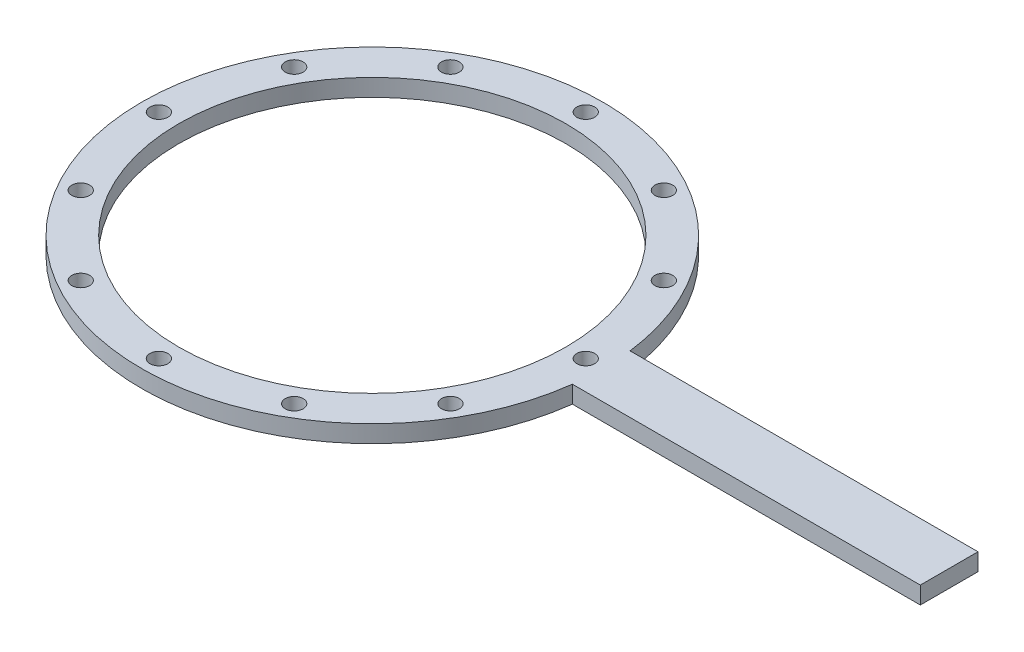
ISO-10303-21;
HEADER;
FILE_DESCRIPTION(('STEP AP214'),'2;1');
FILE_NAME('part.step','',(''),(''),'','','');
FILE_SCHEMA(('AUTOMOTIVE_DESIGN { 1 0 10303 214 1 1 1 1 }'));
ENDSEC;
DATA;
#1=APPLICATION_CONTEXT('core data for automotive mechanical design processes');
#2=APPLICATION_PROTOCOL_DEFINITION('international standard','automotive_design',2000,#1);
#3=PRODUCT_CONTEXT('',#1,'mechanical');
#4=PRODUCT('Part','Part','',(#3));
#5=PRODUCT_RELATED_PRODUCT_CATEGORY('part','',(#4));
#6=PRODUCT_DEFINITION_FORMATION('','',#4);
#7=PRODUCT_DEFINITION_CONTEXT('part definition',#1,'design');
#8=PRODUCT_DEFINITION('design','',#6,#7);
#9=PRODUCT_DEFINITION_SHAPE('','',#8);
#10=(LENGTH_UNIT() NAMED_UNIT(*) SI_UNIT(.MILLI.,.METRE.));
#11=(NAMED_UNIT(*) PLANE_ANGLE_UNIT() SI_UNIT($,.RADIAN.));
#12=(NAMED_UNIT(*) SI_UNIT($,.STERADIAN.) SOLID_ANGLE_UNIT());
#13=UNCERTAINTY_MEASURE_WITH_UNIT(LENGTH_MEASURE(1.E-05),#10,'distance_accuracy_value','');
#14=(GEOMETRIC_REPRESENTATION_CONTEXT(3) GLOBAL_UNCERTAINTY_ASSIGNED_CONTEXT((#13)) GLOBAL_UNIT_ASSIGNED_CONTEXT((#10,
#11,#12)) REPRESENTATION_CONTEXT('',''));
#15=CARTESIAN_POINT('',(0.,0.,0.));
#16=DIRECTION('',(0.,0.,1.));
#17=DIRECTION('',(1.,0.,0.));
#18=AXIS2_PLACEMENT_3D('',#15,#16,#17);
#19=CARTESIAN_POINT('',(0.,3.,5.00000000000001));
#20=DIRECTION('',(0.,0.,1.));
#21=DIRECTION('',(1.,0.,0.));
#22=AXIS2_PLACEMENT_3D('',#19,#20,#21);
#23=PLANE('',#22);
#24=DIRECTION('',(-1.,0.,0.));
#25=VECTOR('',#24,1.);
#26=CARTESIAN_POINT('',(0.,0.,5.00000000000001));
#27=LINE('',#26,#25);
#28=CARTESIAN_POINT('',(100.,0.,5.));
#29=VERTEX_POINT('',#28);
#30=CARTESIAN_POINT('',(39.6862696659689,0.,5.00000000000001));
#31=VERTEX_POINT('',#30);
#32=EDGE_CURVE('E156',#29,#31,#27,.T.);
#33=ORIENTED_EDGE('',*,*,#32,.F.);
#34=DIRECTION('',(0.,-1.,0.));
#35=VECTOR('',#34,1.);
#36=CARTESIAN_POINT('',(100.,3.,5.));
#37=LINE('',#36,#35);
#38=CARTESIAN_POINT('',(100.,3.,5.));
#39=VERTEX_POINT('',#38);
#40=EDGE_CURVE('E117',#39,#29,#37,.T.);
#41=ORIENTED_EDGE('',*,*,#40,.F.);
#42=DIRECTION('',(-1.,0.,0.));
#43=VECTOR('',#42,1.);
#44=CARTESIAN_POINT('',(0.,3.,5.00000000000001));
#45=LINE('',#44,#43);
#46=CARTESIAN_POINT('',(39.6862696659689,3.,5.00000000000001));
#47=VERTEX_POINT('',#46);
#48=EDGE_CURVE('E153',#39,#47,#45,.T.);
#49=ORIENTED_EDGE('',*,*,#48,.T.);
#50=DIRECTION('',(0.,-1.,0.));
#51=VECTOR('',#50,1.);
#52=CARTESIAN_POINT('',(39.6862696659689,3.,5.00000000000001));
#53=LINE('',#52,#51);
#54=EDGE_CURVE('E12',#47,#31,#53,.T.);
#55=ORIENTED_EDGE('',*,*,#54,.T.);
#56=EDGE_LOOP('',(#33,#41,#49,#55));
#57=FACE_BOUND('',#56,.T.);
#58=ADVANCED_FACE('F110',(#57),#23,.T.);
#59=CARTESIAN_POINT('',(0.,0.,0.));
#60=DIRECTION('',(0.,1.,0.));
#61=DIRECTION('',(0.,0.,1.));
#62=AXIS2_PLACEMENT_3D('',#59,#60,#61);
#63=PLANE('',#62);
#64=CARTESIAN_POINT('',(18.4999999999999,0.,-32.0429399400243));
#65=DIRECTION('',(0.,1.,0.));
#66=DIRECTION('',(0.86602540378444,0.,0.499999999999998));
#67=AXIS2_PLACEMENT_3D('',#64,#65,#66);
#68=CIRCLE('',#67,1.55);
#69=CARTESIAN_POINT('',(19.8423393758658,0.,-31.2679399400243));
#70=VERTEX_POINT('',#69);
#71=EDGE_CURVE('E217',#70,#70,#68,.T.);
#72=ORIENTED_EDGE('',*,*,#71,.T.);
#73=EDGE_LOOP('',(#72));
#74=FACE_BOUND('',#73,.T.);
#75=CARTESIAN_POINT('',(-1.29184809537196E-13,0.,-37.));
#76=DIRECTION('',(0.,1.,0.));
#77=DIRECTION('',(1.,0.,0.));
#78=AXIS2_PLACEMENT_3D('',#75,#76,#77);
#79=CIRCLE('',#78,1.55);
#80=CARTESIAN_POINT('',(1.54999999999987,0.,-37.));
#81=VERTEX_POINT('',#80);
#82=EDGE_CURVE('E273',#81,#81,#79,.T.);
#83=ORIENTED_EDGE('',*,*,#82,.T.);
#84=EDGE_LOOP('',(#83));
#85=FACE_BOUND('',#84,.T.);
#86=CARTESIAN_POINT('',(-18.5000000000002,0.,-32.0429399400241));
#87=DIRECTION('',(0.,1.,0.));
#88=DIRECTION('',(0.866025403784436,0.,-0.500000000000004));
#89=AXIS2_PLACEMENT_3D('',#86,#87,#88);
#90=CIRCLE('',#89,1.55);
#91=CARTESIAN_POINT('',(-17.1576606241343,0.,-32.8179399400242));
#92=VERTEX_POINT('',#91);
#93=EDGE_CURVE('E270',#92,#92,#90,.T.);
#94=ORIENTED_EDGE('',*,*,#93,.T.);
#95=EDGE_LOOP('',(#94));
#96=FACE_BOUND('',#95,.T.);
#97=CARTESIAN_POINT('',(-32.0429399400243,0.,-18.4999999999998));
#98=DIRECTION('',(0.,1.,0.));
#99=DIRECTION('',(0.499999999999995,0.,-0.866025403784442));
#100=AXIS2_PLACEMENT_3D('',#97,#98,#99);
#101=CIRCLE('',#100,1.55);
#102=CARTESIAN_POINT('',(-31.2679399400243,0.,-19.8423393758657));
#103=VERTEX_POINT('',#102);
#104=EDGE_CURVE('E256',#103,#103,#101,.T.);
#105=ORIENTED_EDGE('',*,*,#104,.T.);
#106=EDGE_LOOP('',(#105));
#107=FACE_BOUND('',#106,.T.);
#108=CARTESIAN_POINT('',(-37.,0.,0.));
#109=DIRECTION('',(0.,1.,0.));
#110=DIRECTION('',(0.,0.,-1.));
#111=AXIS2_PLACEMENT_3D('',#108,#109,#110);
#112=CIRCLE('',#111,1.55);
#113=CARTESIAN_POINT('',(-37.,0.,-1.55));
#114=VERTEX_POINT('',#113);
#115=EDGE_CURVE('E252',#114,#114,#112,.T.);
#116=ORIENTED_EDGE('',*,*,#115,.T.);
#117=EDGE_LOOP('',(#116));
#118=FACE_BOUND('',#117,.T.);
#119=CARTESIAN_POINT('',(-32.0429399400241,0.,18.5000000000003));
#120=DIRECTION('',(0.,1.,0.));
#121=DIRECTION('',(-0.500000000000007,0.,-0.866025403784435));
#122=AXIS2_PLACEMENT_3D('',#119,#120,#121);
#123=CIRCLE('',#122,1.55);
#124=CARTESIAN_POINT('',(-32.8179399400241,0.,17.1576606241344));
#125=VERTEX_POINT('',#124);
#126=EDGE_CURVE('E243',#125,#125,#123,.T.);
#127=ORIENTED_EDGE('',*,*,#126,.T.);
#128=EDGE_LOOP('',(#127));
#129=FACE_BOUND('',#128,.T.);
#130=CARTESIAN_POINT('',(-18.4999999999997,0.,32.0429399400244));
#131=DIRECTION('',(0.,1.,0.));
#132=DIRECTION('',(-0.866025403784443,0.,-0.499999999999992));
#133=AXIS2_PLACEMENT_3D('',#130,#131,#132);
#134=CIRCLE('',#133,1.55);
#135=CARTESIAN_POINT('',(-19.8423393758656,0.,31.2679399400244));
#136=VERTEX_POINT('',#135);
#137=EDGE_CURVE('E232',#136,#136,#134,.T.);
#138=ORIENTED_EDGE('',*,*,#137,.T.);
#139=EDGE_LOOP('',(#138));
#140=FACE_BOUND('',#139,.T.);
#141=CARTESIAN_POINT('',(3.87554428611588E-13,0.,37.));
#142=DIRECTION('',(0.,1.,0.));
#143=DIRECTION('',(-1.,0.,0.));
#144=AXIS2_PLACEMENT_3D('',#141,#142,#143);
#145=CIRCLE('',#144,1.55);
#146=CARTESIAN_POINT('',(-1.54999999999961,0.,37.));
#147=VERTEX_POINT('',#146);
#148=EDGE_CURVE('E228',#147,#147,#145,.T.);
#149=ORIENTED_EDGE('',*,*,#148,.T.);
#150=EDGE_LOOP('',(#149));
#151=FACE_BOUND('',#150,.T.);
#152=CARTESIAN_POINT('',(18.5000000000004,0.,32.042939940024));
#153=DIRECTION('',(0.,1.,0.));
#154=DIRECTION('',(-0.866025403784433,0.,0.50000000000001));
#155=AXIS2_PLACEMENT_3D('',#152,#153,#154);
#156=CIRCLE('',#155,1.55);
#157=CARTESIAN_POINT('',(17.1576606241345,0.,32.817939940024));
#158=VERTEX_POINT('',#157);
#159=EDGE_CURVE('E227',#158,#158,#156,.T.);
#160=ORIENTED_EDGE('',*,*,#159,.T.);
#161=EDGE_LOOP('',(#160));
#162=FACE_BOUND('',#161,.T.);
#163=CARTESIAN_POINT('',(32.0429399400245,0.,18.4999999999996));
#164=DIRECTION('',(0.,1.,0.));
#165=DIRECTION('',(-0.499999999999989,0.,0.866025403784445));
#166=AXIS2_PLACEMENT_3D('',#163,#164,#165);
#167=CIRCLE('',#166,1.55);
#168=CARTESIAN_POINT('',(31.2679399400245,0.,19.8423393758655));
#169=VERTEX_POINT('',#168);
#170=EDGE_CURVE('E289',#169,#169,#167,.T.);
#171=ORIENTED_EDGE('',*,*,#170,.T.);
#172=EDGE_LOOP('',(#171));
#173=FACE_BOUND('',#172,.T.);
#174=CARTESIAN_POINT('',(32.0429399400242,0.,-18.5));
#175=DIRECTION('',(0.,1.,0.));
#176=DIRECTION('',(0.500000000000001,0.,0.866025403784438));
#177=AXIS2_PLACEMENT_3D('',#174,#175,#176);
#178=CIRCLE('',#177,1.55);
#179=CARTESIAN_POINT('',(32.8179399400242,0.,-17.1576606241342));
#180=VERTEX_POINT('',#179);
#181=EDGE_CURVE('E215',#180,#180,#178,.T.);
#182=ORIENTED_EDGE('',*,*,#181,.T.);
#183=EDGE_LOOP('',(#182));
#184=FACE_BOUND('',#183,.T.);
#185=CARTESIAN_POINT('',(37.,0.,0.));
#186=DIRECTION('',(0.,1.,0.));
#187=DIRECTION('',(0.,0.,1.));
#188=AXIS2_PLACEMENT_3D('',#185,#186,#187);
#189=CIRCLE('',#188,1.55);
#190=CARTESIAN_POINT('',(37.,0.,1.55));
#191=VERTEX_POINT('',#190);
#192=EDGE_CURVE('E199',#191,#191,#189,.T.);
#193=ORIENTED_EDGE('',*,*,#192,.T.);
#194=EDGE_LOOP('',(#193));
#195=FACE_BOUND('',#194,.T.);
#196=ORIENTED_EDGE('',*,*,#32,.T.);
#197=CARTESIAN_POINT('',(0.,0.,0.));
#198=DIRECTION('',(0.,1.,0.));
#199=DIRECTION('',(0.,0.,1.));
#200=AXIS2_PLACEMENT_3D('',#197,#198,#199);
#201=CIRCLE('',#200,40.);
#202=CARTESIAN_POINT('',(39.6862696659689,0.,-5.00000000000001));
#203=VERTEX_POINT('',#202);
#204=EDGE_CURVE('E111',#203,#31,#201,.T.);
#205=ORIENTED_EDGE('',*,*,#204,.F.);
#206=DIRECTION('',(-1.,0.,0.));
#207=VECTOR('',#206,1.);
#208=CARTESIAN_POINT('',(0.,0.,-5.00000000000001));
#209=LINE('',#208,#207);
#210=CARTESIAN_POINT('',(100.,0.,-5.));
#211=VERTEX_POINT('',#210);
#212=EDGE_CURVE('E171',#211,#203,#209,.T.);
#213=ORIENTED_EDGE('',*,*,#212,.F.);
#214=DIRECTION('',(0.,0.,1.));
#215=VECTOR('',#214,1.);
#216=CARTESIAN_POINT('',(100.,0.,0.));
#217=LINE('',#216,#215);
#218=EDGE_CURVE('E182',#211,#29,#217,.T.);
#219=ORIENTED_EDGE('',*,*,#218,.T.);
#220=EDGE_LOOP('',(#196,#205,#213,#219));
#221=FACE_BOUND('',#220,.T.);
#222=CARTESIAN_POINT('',(0.,0.,0.));
#223=DIRECTION('',(0.,1.,0.));
#224=DIRECTION('',(0.,0.,1.));
#225=AXIS2_PLACEMENT_3D('',#222,#223,#224);
#226=CIRCLE('',#225,33.55);
#227=CARTESIAN_POINT('',(0.,0.,33.55));
#228=VERTEX_POINT('',#227);
#229=EDGE_CURVE('E200',#228,#228,#226,.T.);
#230=ORIENTED_EDGE('',*,*,#229,.T.);
#231=EDGE_LOOP('',(#230));
#232=FACE_BOUND('',#231,.T.);
#233=ADVANCED_FACE('F305',(#74,#85,#96,#107,#118,#129,#140,#151,#162,#173,#184,#195,#221,#232),
#63,.F.);
#234=CARTESIAN_POINT('',(100.,3.,0.));
#235=DIRECTION('',(1.,0.,0.));
#236=DIRECTION('',(0.,0.,-1.));
#237=AXIS2_PLACEMENT_3D('',#234,#235,#236);
#238=PLANE('',#237);
#239=ORIENTED_EDGE('',*,*,#218,.F.);
#240=DIRECTION('',(0.,-1.,0.));
#241=VECTOR('',#240,1.);
#242=CARTESIAN_POINT('',(100.,3.,-5.));
#243=LINE('',#242,#241);
#244=CARTESIAN_POINT('',(100.,3.,-5.));
#245=VERTEX_POINT('',#244);
#246=EDGE_CURVE('E139',#245,#211,#243,.T.);
#247=ORIENTED_EDGE('',*,*,#246,.F.);
#248=DIRECTION('',(0.,0.,1.));
#249=VECTOR('',#248,1.);
#250=CARTESIAN_POINT('',(100.,3.,0.));
#251=LINE('',#250,#249);
#252=EDGE_CURVE('E166',#245,#39,#251,.T.);
#253=ORIENTED_EDGE('',*,*,#252,.T.);
#254=ORIENTED_EDGE('',*,*,#40,.T.);
#255=EDGE_LOOP('',(#239,#247,#253,#254));
#256=FACE_BOUND('',#255,.T.);
#257=ADVANCED_FACE('F173',(#256),#238,.T.);
#258=CARTESIAN_POINT('',(0.,3.,-5.00000000000001));
#259=DIRECTION('',(0.,0.,1.));
#260=DIRECTION('',(1.,0.,0.));
#261=AXIS2_PLACEMENT_3D('',#258,#259,#260);
#262=PLANE('',#261);
#263=ORIENTED_EDGE('',*,*,#212,.T.);
#264=DIRECTION('',(0.,-1.,0.));
#265=VECTOR('',#264,1.);
#266=CARTESIAN_POINT('',(39.6862696659689,3.,-5.00000000000001));
#267=LINE('',#266,#265);
#268=CARTESIAN_POINT('',(39.6862696659689,3.,-5.00000000000001));
#269=VERTEX_POINT('',#268);
#270=EDGE_CURVE('E130',#269,#203,#267,.T.);
#271=ORIENTED_EDGE('',*,*,#270,.F.);
#272=DIRECTION('',(-1.,0.,0.));
#273=VECTOR('',#272,1.);
#274=CARTESIAN_POINT('',(0.,3.,-5.00000000000001));
#275=LINE('',#274,#273);
#276=EDGE_CURVE('E174',#245,#269,#275,.T.);
#277=ORIENTED_EDGE('',*,*,#276,.F.);
#278=ORIENTED_EDGE('',*,*,#246,.T.);
#279=EDGE_LOOP('',(#263,#271,#277,#278));
#280=FACE_BOUND('',#279,.T.);
#281=ADVANCED_FACE('F314',(#280),#262,.F.);
#282=CARTESIAN_POINT('',(0.,3.,0.));
#283=DIRECTION('',(0.,1.,0.));
#284=DIRECTION('',(0.,0.,1.));
#285=AXIS2_PLACEMENT_3D('',#282,#283,#284);
#286=PLANE('',#285);
#287=CARTESIAN_POINT('',(18.4999999999999,3.,-32.0429399400243));
#288=DIRECTION('',(0.,1.,0.));
#289=DIRECTION('',(0.86602540378444,0.,0.499999999999998));
#290=AXIS2_PLACEMENT_3D('',#287,#288,#289);
#291=CIRCLE('',#290,1.55);
#292=CARTESIAN_POINT('',(19.8423393758658,3.,-31.2679399400243));
#293=VERTEX_POINT('',#292);
#294=EDGE_CURVE('E276',#293,#293,#291,.T.);
#295=ORIENTED_EDGE('',*,*,#294,.F.);
#296=EDGE_LOOP('',(#295));
#297=FACE_BOUND('',#296,.T.);
#298=CARTESIAN_POINT('',(-1.29184809537196E-13,3.,-37.));
#299=DIRECTION('',(0.,1.,0.));
#300=DIRECTION('',(1.,0.,0.));
#301=AXIS2_PLACEMENT_3D('',#298,#299,#300);
#302=CIRCLE('',#301,1.55);
#303=CARTESIAN_POINT('',(1.54999999999987,3.,-37.));
#304=VERTEX_POINT('',#303);
#305=EDGE_CURVE('E272',#304,#304,#302,.T.);
#306=ORIENTED_EDGE('',*,*,#305,.F.);
#307=EDGE_LOOP('',(#306));
#308=FACE_BOUND('',#307,.T.);
#309=CARTESIAN_POINT('',(-18.5000000000002,3.,-32.0429399400241));
#310=DIRECTION('',(0.,1.,0.));
#311=DIRECTION('',(0.866025403784436,0.,-0.500000000000004));
#312=AXIS2_PLACEMENT_3D('',#309,#310,#311);
#313=CIRCLE('',#312,1.55);
#314=CARTESIAN_POINT('',(-17.1576606241343,3.,-32.8179399400242));
#315=VERTEX_POINT('',#314);
#316=EDGE_CURVE('E262',#315,#315,#313,.T.);
#317=ORIENTED_EDGE('',*,*,#316,.F.);
#318=EDGE_LOOP('',(#317));
#319=FACE_BOUND('',#318,.T.);
#320=CARTESIAN_POINT('',(-32.0429399400243,3.,-18.4999999999998));
#321=DIRECTION('',(0.,1.,0.));
#322=DIRECTION('',(0.499999999999995,0.,-0.866025403784442));
#323=AXIS2_PLACEMENT_3D('',#320,#321,#322);
#324=CIRCLE('',#323,1.55);
#325=CARTESIAN_POINT('',(-31.2679399400243,3.,-19.8423393758657));
#326=VERTEX_POINT('',#325);
#327=EDGE_CURVE('E253',#326,#326,#324,.T.);
#328=ORIENTED_EDGE('',*,*,#327,.F.);
#329=EDGE_LOOP('',(#328));
#330=FACE_BOUND('',#329,.T.);
#331=CARTESIAN_POINT('',(-37.,3.,0.));
#332=DIRECTION('',(0.,1.,0.));
#333=DIRECTION('',(0.,0.,-1.));
#334=AXIS2_PLACEMENT_3D('',#331,#332,#333);
#335=CIRCLE('',#334,1.55);
#336=CARTESIAN_POINT('',(-37.,3.,-1.55));
#337=VERTEX_POINT('',#336);
#338=EDGE_CURVE('E250',#337,#337,#335,.T.);
#339=ORIENTED_EDGE('',*,*,#338,.F.);
#340=EDGE_LOOP('',(#339));
#341=FACE_BOUND('',#340,.T.);
#342=CARTESIAN_POINT('',(-32.0429399400241,3.,18.5000000000003));
#343=DIRECTION('',(0.,1.,0.));
#344=DIRECTION('',(-0.500000000000007,0.,-0.866025403784435));
#345=AXIS2_PLACEMENT_3D('',#342,#343,#344);
#346=CIRCLE('',#345,1.55);
#347=CARTESIAN_POINT('',(-32.8179399400241,3.,17.1576606241344));
#348=VERTEX_POINT('',#347);
#349=EDGE_CURVE('E237',#348,#348,#346,.T.);
#350=ORIENTED_EDGE('',*,*,#349,.F.);
#351=EDGE_LOOP('',(#350));
#352=FACE_BOUND('',#351,.T.);
#353=CARTESIAN_POINT('',(-18.4999999999997,3.,32.0429399400244));
#354=DIRECTION('',(0.,1.,0.));
#355=DIRECTION('',(-0.866025403784443,0.,-0.499999999999992));
#356=AXIS2_PLACEMENT_3D('',#353,#354,#355);
#357=CIRCLE('',#356,1.55);
#358=CARTESIAN_POINT('',(-19.8423393758656,3.,31.2679399400244));
#359=VERTEX_POINT('',#358);
#360=EDGE_CURVE('E233',#359,#359,#357,.T.);
#361=ORIENTED_EDGE('',*,*,#360,.F.);
#362=EDGE_LOOP('',(#361));
#363=FACE_BOUND('',#362,.T.);
#364=CARTESIAN_POINT('',(3.87554428611588E-13,3.,37.));
#365=DIRECTION('',(0.,1.,0.));
#366=DIRECTION('',(-1.,0.,0.));
#367=AXIS2_PLACEMENT_3D('',#364,#365,#366);
#368=CIRCLE('',#367,1.55);
#369=CARTESIAN_POINT('',(-1.54999999999961,3.,37.));
#370=VERTEX_POINT('',#369);
#371=EDGE_CURVE('E225',#370,#370,#368,.T.);
#372=ORIENTED_EDGE('',*,*,#371,.F.);
#373=EDGE_LOOP('',(#372));
#374=FACE_BOUND('',#373,.T.);
#375=CARTESIAN_POINT('',(18.5000000000004,3.,32.042939940024));
#376=DIRECTION('',(0.,1.,0.));
#377=DIRECTION('',(-0.866025403784433,0.,0.50000000000001));
#378=AXIS2_PLACEMENT_3D('',#375,#376,#377);
#379=CIRCLE('',#378,1.55);
#380=CARTESIAN_POINT('',(17.1576606241345,3.,32.817939940024));
#381=VERTEX_POINT('',#380);
#382=EDGE_CURVE('E295',#381,#381,#379,.T.);
#383=ORIENTED_EDGE('',*,*,#382,.F.);
#384=EDGE_LOOP('',(#383));
#385=FACE_BOUND('',#384,.T.);
#386=CARTESIAN_POINT('',(32.0429399400245,3.,18.4999999999996));
#387=DIRECTION('',(0.,1.,0.));
#388=DIRECTION('',(-0.499999999999989,0.,0.866025403784445));
#389=AXIS2_PLACEMENT_3D('',#386,#387,#388);
#390=CIRCLE('',#389,1.55);
#391=CARTESIAN_POINT('',(31.2679399400245,3.,19.8423393758655));
#392=VERTEX_POINT('',#391);
#393=EDGE_CURVE('E286',#392,#392,#390,.T.);
#394=ORIENTED_EDGE('',*,*,#393,.F.);
#395=EDGE_LOOP('',(#394));
#396=FACE_BOUND('',#395,.T.);
#397=CARTESIAN_POINT('',(32.0429399400242,3.,-18.5));
#398=DIRECTION('',(0.,1.,0.));
#399=DIRECTION('',(0.500000000000001,0.,0.866025403784438));
#400=AXIS2_PLACEMENT_3D('',#397,#398,#399);
#401=CIRCLE('',#400,1.55);
#402=CARTESIAN_POINT('',(32.8179399400242,3.,-17.1576606241342));
#403=VERTEX_POINT('',#402);
#404=EDGE_CURVE('E211',#403,#403,#401,.T.);
#405=ORIENTED_EDGE('',*,*,#404,.F.);
#406=EDGE_LOOP('',(#405));
#407=FACE_BOUND('',#406,.T.);
#408=CARTESIAN_POINT('',(37.,3.,0.));
#409=DIRECTION('',(0.,1.,0.));
#410=DIRECTION('',(0.,0.,1.));
#411=AXIS2_PLACEMENT_3D('',#408,#409,#410);
#412=CIRCLE('',#411,1.55);
#413=CARTESIAN_POINT('',(37.,3.,1.55));
#414=VERTEX_POINT('',#413);
#415=EDGE_CURVE('E207',#414,#414,#412,.T.);
#416=ORIENTED_EDGE('',*,*,#415,.F.);
#417=EDGE_LOOP('',(#416));
#418=FACE_BOUND('',#417,.T.);
#419=ORIENTED_EDGE('',*,*,#276,.T.);
#420=CARTESIAN_POINT('',(0.,3.,0.));
#421=DIRECTION('',(0.,1.,0.));
#422=DIRECTION('',(0.,0.,1.));
#423=AXIS2_PLACEMENT_3D('',#420,#421,#422);
#424=CIRCLE('',#423,40.);
#425=EDGE_CURVE('E169',#269,#47,#424,.T.);
#426=ORIENTED_EDGE('',*,*,#425,.T.);
#427=ORIENTED_EDGE('',*,*,#48,.F.);
#428=ORIENTED_EDGE('',*,*,#252,.F.);
#429=EDGE_LOOP('',(#419,#426,#427,#428));
#430=FACE_BOUND('',#429,.T.);
#431=CARTESIAN_POINT('',(0.,3.,0.));
#432=DIRECTION('',(0.,1.,0.));
#433=DIRECTION('',(0.,0.,1.));
#434=AXIS2_PLACEMENT_3D('',#431,#432,#433);
#435=CIRCLE('',#434,33.55);
#436=CARTESIAN_POINT('',(0.,3.,33.55));
#437=VERTEX_POINT('',#436);
#438=EDGE_CURVE('E195',#437,#437,#435,.T.);
#439=ORIENTED_EDGE('',*,*,#438,.F.);
#440=EDGE_LOOP('',(#439));
#441=FACE_BOUND('',#440,.T.);
#442=ADVANCED_FACE('F168',(#297,#308,#319,#330,#341,#352,#363,#374,#385,#396,#407,#418,#430,
#441),#286,.T.);
#443=CARTESIAN_POINT('',(0.,3.,0.));
#444=DIRECTION('',(0.,-1.,0.));
#445=DIRECTION('',(0.,0.,-1.));
#446=AXIS2_PLACEMENT_3D('',#443,#444,#445);
#447=CYLINDRICAL_SURFACE('',#446,33.55);
#448=ORIENTED_EDGE('',*,*,#438,.T.);
#449=EDGE_LOOP('',(#448));
#450=FACE_BOUND('',#449,.T.);
#451=ORIENTED_EDGE('',*,*,#229,.F.);
#452=EDGE_LOOP('',(#451));
#453=FACE_BOUND('',#452,.T.);
#454=ADVANCED_FACE('F107',(#450,#453),#447,.F.);
#455=CARTESIAN_POINT('',(0.,3.,0.));
#456=DIRECTION('',(0.,-1.,0.));
#457=DIRECTION('',(0.,0.,-1.));
#458=AXIS2_PLACEMENT_3D('',#455,#456,#457);
#459=CYLINDRICAL_SURFACE('',#458,40.);
#460=ORIENTED_EDGE('',*,*,#204,.T.);
#461=ORIENTED_EDGE('',*,*,#54,.F.);
#462=ORIENTED_EDGE('',*,*,#425,.F.);
#463=ORIENTED_EDGE('',*,*,#270,.T.);
#464=EDGE_LOOP('',(#460,#461,#462,#463));
#465=FACE_BOUND('',#464,.T.);
#466=ADVANCED_FACE('F316',(#465),#459,.T.);
#467=CARTESIAN_POINT('',(37.,0.,0.));
#468=DIRECTION('',(0.,1.,0.));
#469=DIRECTION('',(0.,0.,1.));
#470=AXIS2_PLACEMENT_3D('',#467,#468,#469);
#471=CYLINDRICAL_SURFACE('',#470,1.55);
#472=ORIENTED_EDGE('',*,*,#192,.F.);
#473=EDGE_LOOP('',(#472));
#474=FACE_BOUND('',#473,.T.);
#475=ORIENTED_EDGE('',*,*,#415,.T.);
#476=EDGE_LOOP('',(#475));
#477=FACE_BOUND('',#476,.T.);
#478=ADVANCED_FACE('F319',(#474,#477),#471,.F.);
#479=CARTESIAN_POINT('',(32.0429399400242,0.,-18.5));
#480=DIRECTION('',(0.,1.,0.));
#481=DIRECTION('',(0.,0.,1.));
#482=AXIS2_PLACEMENT_3D('',#479,#480,#481);
#483=CYLINDRICAL_SURFACE('',#482,1.55);
#484=ORIENTED_EDGE('',*,*,#181,.F.);
#485=EDGE_LOOP('',(#484));
#486=FACE_BOUND('',#485,.T.);
#487=ORIENTED_EDGE('',*,*,#404,.T.);
#488=EDGE_LOOP('',(#487));
#489=FACE_BOUND('',#488,.T.);
#490=ADVANCED_FACE('F330',(#486,#489),#483,.F.);
#491=CARTESIAN_POINT('',(32.0429399400245,0.,18.4999999999996));
#492=DIRECTION('',(0.,1.,0.));
#493=DIRECTION('',(0.,0.,1.));
#494=AXIS2_PLACEMENT_3D('',#491,#492,#493);
#495=CYLINDRICAL_SURFACE('',#494,1.55);
#496=ORIENTED_EDGE('',*,*,#170,.F.);
#497=EDGE_LOOP('',(#496));
#498=FACE_BOUND('',#497,.T.);
#499=ORIENTED_EDGE('',*,*,#393,.T.);
#500=EDGE_LOOP('',(#499));
#501=FACE_BOUND('',#500,.T.);
#502=ADVANCED_FACE('F307',(#498,#501),#495,.F.);
#503=CARTESIAN_POINT('',(18.5000000000004,0.,32.042939940024));
#504=DIRECTION('',(0.,1.,0.));
#505=DIRECTION('',(0.,0.,1.));
#506=AXIS2_PLACEMENT_3D('',#503,#504,#505);
#507=CYLINDRICAL_SURFACE('',#506,1.55);
#508=ORIENTED_EDGE('',*,*,#159,.F.);
#509=EDGE_LOOP('',(#508));
#510=FACE_BOUND('',#509,.T.);
#511=ORIENTED_EDGE('',*,*,#382,.T.);
#512=EDGE_LOOP('',(#511));
#513=FACE_BOUND('',#512,.T.);
#514=ADVANCED_FACE('F304',(#510,#513),#507,.F.);
#515=CARTESIAN_POINT('',(3.87554428611588E-13,0.,37.));
#516=DIRECTION('',(0.,1.,0.));
#517=DIRECTION('',(0.,0.,1.));
#518=AXIS2_PLACEMENT_3D('',#515,#516,#517);
#519=CYLINDRICAL_SURFACE('',#518,1.55);
#520=ORIENTED_EDGE('',*,*,#148,.F.);
#521=EDGE_LOOP('',(#520));
#522=FACE_BOUND('',#521,.T.);
#523=ORIENTED_EDGE('',*,*,#371,.T.);
#524=EDGE_LOOP('',(#523));
#525=FACE_BOUND('',#524,.T.);
#526=ADVANCED_FACE('F308',(#522,#525),#519,.F.);
#527=CARTESIAN_POINT('',(-18.4999999999997,0.,32.0429399400244));
#528=DIRECTION('',(0.,1.,0.));
#529=DIRECTION('',(0.,0.,1.));
#530=AXIS2_PLACEMENT_3D('',#527,#528,#529);
#531=CYLINDRICAL_SURFACE('',#530,1.55);
#532=ORIENTED_EDGE('',*,*,#137,.F.);
#533=EDGE_LOOP('',(#532));
#534=FACE_BOUND('',#533,.T.);
#535=ORIENTED_EDGE('',*,*,#360,.T.);
#536=EDGE_LOOP('',(#535));
#537=FACE_BOUND('',#536,.T.);
#538=ADVANCED_FACE('F400',(#534,#537),#531,.F.);
#539=CARTESIAN_POINT('',(-32.0429399400241,0.,18.5000000000003));
#540=DIRECTION('',(0.,1.,0.));
#541=DIRECTION('',(0.,0.,1.));
#542=AXIS2_PLACEMENT_3D('',#539,#540,#541);
#543=CYLINDRICAL_SURFACE('',#542,1.55);
#544=ORIENTED_EDGE('',*,*,#126,.F.);
#545=EDGE_LOOP('',(#544));
#546=FACE_BOUND('',#545,.T.);
#547=ORIENTED_EDGE('',*,*,#349,.T.);
#548=EDGE_LOOP('',(#547));
#549=FACE_BOUND('',#548,.T.);
#550=ADVANCED_FACE('F410',(#546,#549),#543,.F.);
#551=CARTESIAN_POINT('',(-37.,0.,0.));
#552=DIRECTION('',(0.,1.,0.));
#553=DIRECTION('',(0.,0.,1.));
#554=AXIS2_PLACEMENT_3D('',#551,#552,#553);
#555=CYLINDRICAL_SURFACE('',#554,1.55);
#556=ORIENTED_EDGE('',*,*,#115,.F.);
#557=EDGE_LOOP('',(#556));
#558=FACE_BOUND('',#557,.T.);
#559=ORIENTED_EDGE('',*,*,#338,.T.);
#560=EDGE_LOOP('',(#559));
#561=FACE_BOUND('',#560,.T.);
#562=ADVANCED_FACE('F420',(#558,#561),#555,.F.);
#563=CARTESIAN_POINT('',(-32.0429399400243,0.,-18.4999999999998));
#564=DIRECTION('',(0.,1.,0.));
#565=DIRECTION('',(0.,0.,1.));
#566=AXIS2_PLACEMENT_3D('',#563,#564,#565);
#567=CYLINDRICAL_SURFACE('',#566,1.55);
#568=ORIENTED_EDGE('',*,*,#104,.F.);
#569=EDGE_LOOP('',(#568));
#570=FACE_BOUND('',#569,.T.);
#571=ORIENTED_EDGE('',*,*,#327,.T.);
#572=EDGE_LOOP('',(#571));
#573=FACE_BOUND('',#572,.T.);
#574=ADVANCED_FACE('F430',(#570,#573),#567,.F.);
#575=CARTESIAN_POINT('',(-18.5000000000002,0.,-32.0429399400241));
#576=DIRECTION('',(0.,1.,0.));
#577=DIRECTION('',(0.,0.,1.));
#578=AXIS2_PLACEMENT_3D('',#575,#576,#577);
#579=CYLINDRICAL_SURFACE('',#578,1.55);
#580=ORIENTED_EDGE('',*,*,#93,.F.);
#581=EDGE_LOOP('',(#580));
#582=FACE_BOUND('',#581,.T.);
#583=ORIENTED_EDGE('',*,*,#316,.T.);
#584=EDGE_LOOP('',(#583));
#585=FACE_BOUND('',#584,.T.);
#586=ADVANCED_FACE('F440',(#582,#585),#579,.F.);
#587=CARTESIAN_POINT('',(-1.29184809537196E-13,0.,-37.));
#588=DIRECTION('',(0.,1.,0.));
#589=DIRECTION('',(0.,0.,1.));
#590=AXIS2_PLACEMENT_3D('',#587,#588,#589);
#591=CYLINDRICAL_SURFACE('',#590,1.55);
#592=ORIENTED_EDGE('',*,*,#82,.F.);
#593=EDGE_LOOP('',(#592));
#594=FACE_BOUND('',#593,.T.);
#595=ORIENTED_EDGE('',*,*,#305,.T.);
#596=EDGE_LOOP('',(#595));
#597=FACE_BOUND('',#596,.T.);
#598=ADVANCED_FACE('F450',(#594,#597),#591,.F.);
#599=CARTESIAN_POINT('',(18.4999999999999,0.,-32.0429399400243));
#600=DIRECTION('',(0.,1.,0.));
#601=DIRECTION('',(0.,0.,1.));
#602=AXIS2_PLACEMENT_3D('',#599,#600,#601);
#603=CYLINDRICAL_SURFACE('',#602,1.55);
#604=ORIENTED_EDGE('',*,*,#71,.F.);
#605=EDGE_LOOP('',(#604));
#606=FACE_BOUND('',#605,.T.);
#607=ORIENTED_EDGE('',*,*,#294,.T.);
#608=EDGE_LOOP('',(#607));
#609=FACE_BOUND('',#608,.T.);
#610=ADVANCED_FACE('F460',(#606,#609),#603,.F.);
#611=CLOSED_SHELL('',(#58,#233,#257,#281,#442,#454,#466,#478,#490,#502,#514,#526,#538,#550,#562,
#574,#586,#598,#610));
#612=MANIFOLD_SOLID_BREP('B2',#611);
#613=ADVANCED_BREP_SHAPE_REPRESENTATION('',(#18,#612),#14);
#614=SHAPE_DEFINITION_REPRESENTATION(#9,#613);
ENDSEC;
END-ISO-10303-21;
